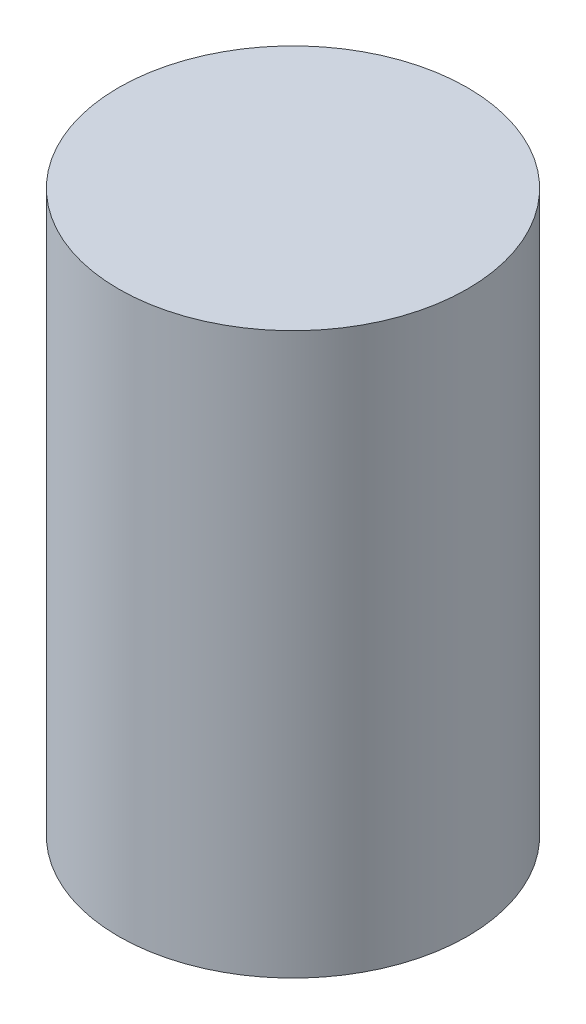
ISO-10303-21;
HEADER;
FILE_DESCRIPTION(('STEP AP214'),'2;1');
FILE_NAME('part.step','',(''),(''),'','','');
FILE_SCHEMA(('AUTOMOTIVE_DESIGN { 1 0 10303 214 1 1 1 1 }'));
ENDSEC;
DATA;
#1=APPLICATION_CONTEXT('core data for automotive mechanical design processes');
#2=APPLICATION_PROTOCOL_DEFINITION('international standard','automotive_design',2000,#1);
#3=PRODUCT_CONTEXT('',#1,'mechanical');
#4=PRODUCT('Part','Part','',(#3));
#5=PRODUCT_RELATED_PRODUCT_CATEGORY('part','',(#4));
#6=PRODUCT_DEFINITION_FORMATION('','',#4);
#7=PRODUCT_DEFINITION_CONTEXT('part definition',#1,'design');
#8=PRODUCT_DEFINITION('design','',#6,#7);
#9=PRODUCT_DEFINITION_SHAPE('','',#8);
#10=(LENGTH_UNIT() NAMED_UNIT(*) SI_UNIT(.MILLI.,.METRE.));
#11=(NAMED_UNIT(*) PLANE_ANGLE_UNIT() SI_UNIT($,.RADIAN.));
#12=(NAMED_UNIT(*) SI_UNIT($,.STERADIAN.) SOLID_ANGLE_UNIT());
#13=UNCERTAINTY_MEASURE_WITH_UNIT(LENGTH_MEASURE(1.E-05),#10,'distance_accuracy_value','');
#14=(GEOMETRIC_REPRESENTATION_CONTEXT(3) GLOBAL_UNCERTAINTY_ASSIGNED_CONTEXT((#13)) GLOBAL_UNIT_ASSIGNED_CONTEXT((#10,
#11,#12)) REPRESENTATION_CONTEXT('',''));
#15=CARTESIAN_POINT('',(0.,0.,0.));
#16=DIRECTION('',(0.,0.,1.));
#17=DIRECTION('',(1.,0.,0.));
#18=AXIS2_PLACEMENT_3D('',#15,#16,#17);
#19=CARTESIAN_POINT('',(-2.30547188249211E-13,-360.,0.));
#20=DIRECTION('',(0.,-1.,0.));
#21=DIRECTION('',(0.,0.,-1.));
#22=AXIS2_PLACEMENT_3D('',#19,#20,#21);
#23=PLANE('',#22);
#24=CARTESIAN_POINT('',(-2.30547188249211E-13,-360.,0.));
#25=DIRECTION('',(0.,-1.,0.));
#26=DIRECTION('',(0.,0.,-1.));
#27=AXIS2_PLACEMENT_3D('',#24,#25,#26);
#28=CIRCLE('',#27,112.);
#29=CARTESIAN_POINT('',(-2.30547188249211E-13,-360.,-112.));
#30=VERTEX_POINT('',#29);
#31=EDGE_CURVE('E10',#30,#30,#28,.T.);
#32=ORIENTED_EDGE('',*,*,#31,.T.);
#33=EDGE_LOOP('',(#32));
#34=FACE_BOUND('',#33,.T.);
#35=ADVANCED_FACE('F41',(#34),#23,.T.);
#36=CARTESIAN_POINT('',(-2.30547188249211E-13,0.,0.));
#37=DIRECTION('',(0.,-1.,0.));
#38=DIRECTION('',(0.,0.,-1.));
#39=AXIS2_PLACEMENT_3D('',#36,#37,#38);
#40=CYLINDRICAL_SURFACE('',#39,112.);
#41=CARTESIAN_POINT('',(-2.30547188249211E-13,0.,0.));
#42=DIRECTION('',(0.,-1.,0.));
#43=DIRECTION('',(0.,0.,-1.));
#44=AXIS2_PLACEMENT_3D('',#41,#42,#43);
#45=CIRCLE('',#44,112.);
#46=CARTESIAN_POINT('',(-2.30547188249211E-13,0.,-112.));
#47=VERTEX_POINT('',#46);
#48=EDGE_CURVE('E50',#47,#47,#45,.T.);
#49=ORIENTED_EDGE('',*,*,#48,.T.);
#50=EDGE_LOOP('',(#49));
#51=FACE_BOUND('',#50,.T.);
#52=ORIENTED_EDGE('',*,*,#31,.F.);
#53=EDGE_LOOP('',(#52));
#54=FACE_BOUND('',#53,.T.);
#55=ADVANCED_FACE('F52',(#51,#54),#40,.T.);
#56=CARTESIAN_POINT('',(-2.30547188249211E-13,0.,0.));
#57=DIRECTION('',(0.,1.,0.));
#58=DIRECTION('',(0.,0.,1.));
#59=AXIS2_PLACEMENT_3D('',#56,#57,#58);
#60=PLANE('',#59);
#61=ORIENTED_EDGE('',*,*,#48,.F.);
#62=EDGE_LOOP('',(#61));
#63=FACE_BOUND('',#62,.T.);
#64=ADVANCED_FACE('F57',(#63),#60,.T.);
#65=CLOSED_SHELL('',(#35,#55,#64));
#66=MANIFOLD_SOLID_BREP('B2',#65);
#67=ADVANCED_BREP_SHAPE_REPRESENTATION('',(#18,#66),#14);
#68=SHAPE_DEFINITION_REPRESENTATION(#9,#67);
ENDSEC;
END-ISO-10303-21;
